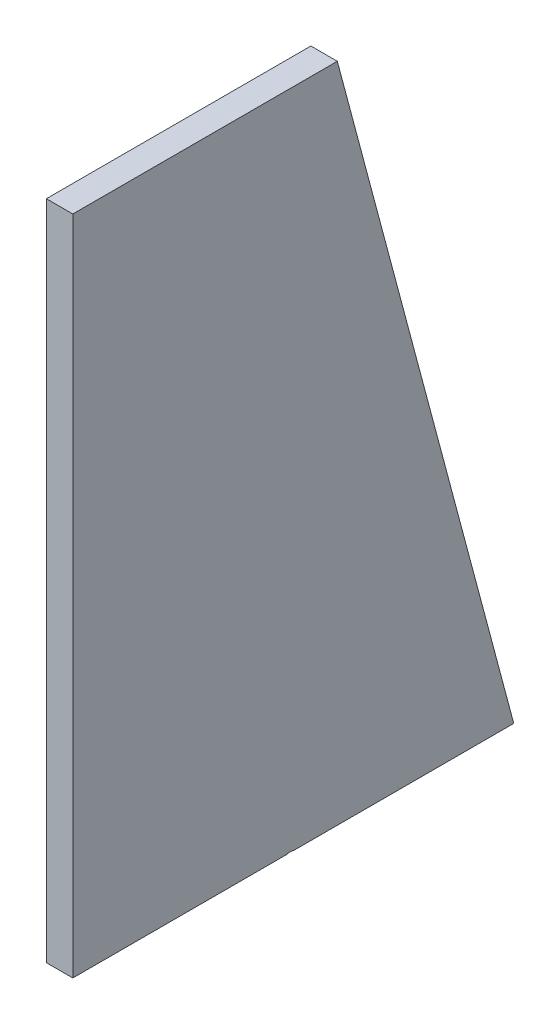
ISO-10303-21;
HEADER;
FILE_DESCRIPTION(('STEP AP214'),'2;1');
FILE_NAME('part.step','',(''),(''),'','','');
FILE_SCHEMA(('AUTOMOTIVE_DESIGN { 1 0 10303 214 1 1 1 1 }'));
ENDSEC;
DATA;
#1=APPLICATION_CONTEXT('core data for automotive mechanical design processes');
#2=APPLICATION_PROTOCOL_DEFINITION('international standard','automotive_design',2000,#1);
#3=PRODUCT_CONTEXT('',#1,'mechanical');
#4=PRODUCT('Part','Part','',(#3));
#5=PRODUCT_RELATED_PRODUCT_CATEGORY('part','',(#4));
#6=PRODUCT_DEFINITION_FORMATION('','',#4);
#7=PRODUCT_DEFINITION_CONTEXT('part definition',#1,'design');
#8=PRODUCT_DEFINITION('design','',#6,#7);
#9=PRODUCT_DEFINITION_SHAPE('','',#8);
#10=(LENGTH_UNIT() NAMED_UNIT(*) SI_UNIT(.MILLI.,.METRE.));
#11=(NAMED_UNIT(*) PLANE_ANGLE_UNIT() SI_UNIT($,.RADIAN.));
#12=(NAMED_UNIT(*) SI_UNIT($,.STERADIAN.) SOLID_ANGLE_UNIT());
#13=UNCERTAINTY_MEASURE_WITH_UNIT(LENGTH_MEASURE(1.E-05),#10,'distance_accuracy_value','');
#14=(GEOMETRIC_REPRESENTATION_CONTEXT(3) GLOBAL_UNCERTAINTY_ASSIGNED_CONTEXT((#13)) GLOBAL_UNIT_ASSIGNED_CONTEXT((#10,
#11,#12)) REPRESENTATION_CONTEXT('',''));
#15=CARTESIAN_POINT('',(0.,0.,0.));
#16=DIRECTION('',(0.,0.,1.));
#17=DIRECTION('',(1.,0.,0.));
#18=AXIS2_PLACEMENT_3D('',#15,#16,#17);
#19=CARTESIAN_POINT('',(6.,0.,0.));
#20=DIRECTION('',(0.,1.,0.));
#21=DIRECTION('',(0.,0.,1.));
#22=AXIS2_PLACEMENT_3D('',#19,#20,#21);
#23=PLANE('',#22);
#24=DIRECTION('',(0.,0.,-1.));
#25=VECTOR('',#24,1.);
#26=CARTESIAN_POINT('',(0.,0.,0.));
#27=LINE('',#26,#25);
#28=CARTESIAN_POINT('',(0.,0.,-48.5913022458668));
#29=VERTEX_POINT('',#28);
#30=CARTESIAN_POINT('',(0.,0.,-50.));
#31=VERTEX_POINT('',#30);
#32=EDGE_CURVE('E61',#29,#31,#27,.T.);
#33=ORIENTED_EDGE('',*,*,#32,.T.);
#34=CARTESIAN_POINT('',(3.,0.,-50.));
#35=DIRECTION('',(0.,-1.,0.));
#36=DIRECTION('',(0.,0.,-1.));
#37=AXIS2_PLACEMENT_3D('',#34,#35,#36);
#38=CIRCLE('',#37,3.);
#39=CARTESIAN_POINT('',(6.,0.,-50.));
#40=VERTEX_POINT('',#39);
#41=EDGE_CURVE('E56',#31,#40,#38,.T.);
#42=ORIENTED_EDGE('',*,*,#41,.T.);
#43=DIRECTION('',(0.,0.,-1.));
#44=VECTOR('',#43,1.);
#45=CARTESIAN_POINT('',(6.,0.,0.));
#46=LINE('',#45,#44);
#47=CARTESIAN_POINT('',(6.,0.,-48.5913022458668));
#48=VERTEX_POINT('',#47);
#49=EDGE_CURVE('E221',#48,#40,#46,.T.);
#50=ORIENTED_EDGE('',*,*,#49,.F.);
#51=DIRECTION('',(1.,0.,0.));
#52=VECTOR('',#51,1.);
#53=CARTESIAN_POINT('',(0.,0.,-48.5913022458668));
#54=LINE('',#53,#52);
#55=CARTESIAN_POINT('',(5.9213287919423,0.,-48.5913022458668));
#56=VERTEX_POINT('',#55);
#57=EDGE_CURVE('E193',#56,#48,#54,.T.);
#58=ORIENTED_EDGE('',*,*,#57,.F.);
#59=DIRECTION('',(0.0595238095238096,0.,-0.998226886083406));
#60=VECTOR('',#59,1.);
#61=CARTESIAN_POINT('',(3.01313805511083,0.,0.179672034646414));
#62=LINE('',#61,#60);
#63=CARTESIAN_POINT('',(4.74689705064596,0.,-28.8958333333333));
#64=VERTEX_POINT('',#63);
#65=EDGE_CURVE('E190',#64,#56,#62,.T.);
#66=ORIENTED_EDGE('',*,*,#65,.F.);
#67=CARTESIAN_POINT('',(3.,0.,-29.));
#68=DIRECTION('',(0.,-1.,0.));
#69=DIRECTION('',(0.,0.,-1.));
#70=AXIS2_PLACEMENT_3D('',#67,#68,#69);
#71=CIRCLE('',#70,1.75);
#72=CARTESIAN_POINT('',(1.25310294935404,0.,-28.8958333333333));
#73=VERTEX_POINT('',#72);
#74=EDGE_CURVE('E141',#64,#73,#71,.T.);
#75=ORIENTED_EDGE('',*,*,#74,.T.);
#76=DIRECTION('',(0.0595238095238098,0.,0.998226886083406));
#77=VECTOR('',#76,1.);
#78=CARTESIAN_POINT('',(2.96560344148782,0.,-0.176837567526233));
#79=LINE('',#78,#77);
#80=CARTESIAN_POINT('',(0.0786712080577037,0.,-48.5913022458668));
#81=VERTEX_POINT('',#80);
#82=EDGE_CURVE('E172',#81,#73,#79,.T.);
#83=ORIENTED_EDGE('',*,*,#82,.F.);
#84=DIRECTION('',(1.,0.,0.));
#85=VECTOR('',#84,1.);
#86=CARTESIAN_POINT('',(0.,0.,-48.5913022458668));
#87=LINE('',#86,#85);
#88=EDGE_CURVE('E196',#29,#81,#87,.T.);
#89=ORIENTED_EDGE('',*,*,#88,.F.);
#90=EDGE_LOOP('',(#33,#42,#50,#58,#66,#75,#83,#89));
#91=FACE_BOUND('',#90,.T.);
#92=ADVANCED_FACE('F41',(#91),#23,.F.);
#93=CARTESIAN_POINT('',(6.,0.,0.));
#94=DIRECTION('',(0.,0.,-1.));
#95=DIRECTION('',(-1.,0.,0.));
#96=AXIS2_PLACEMENT_3D('',#93,#94,#95);
#97=PLANE('',#96);
#98=DIRECTION('',(0.,-1.,0.));
#99=VECTOR('',#98,1.);
#100=CARTESIAN_POINT('',(0.,0.,0.));
#101=LINE('',#100,#99);
#102=CARTESIAN_POINT('',(0.,150.,0.));
#103=VERTEX_POINT('',#102);
#104=CARTESIAN_POINT('',(0.,-0.1,0.));
#105=VERTEX_POINT('',#104);
#106=EDGE_CURVE('E218',#103,#105,#101,.T.);
#107=ORIENTED_EDGE('',*,*,#106,.T.);
#108=DIRECTION('',(-1.,0.,0.));
#109=VECTOR('',#108,1.);
#110=CARTESIAN_POINT('',(0.,-0.1,0.));
#111=LINE('',#110,#109);
#112=CARTESIAN_POINT('',(6.,-0.1,0.));
#113=VERTEX_POINT('',#112);
#114=EDGE_CURVE('E179',#113,#105,#111,.T.);
#115=ORIENTED_EDGE('',*,*,#114,.F.);
#116=DIRECTION('',(0.,-1.,0.));
#117=VECTOR('',#116,1.);
#118=CARTESIAN_POINT('',(6.,0.,0.));
#119=LINE('',#118,#117);
#120=CARTESIAN_POINT('',(6.,150.,0.));
#121=VERTEX_POINT('',#120);
#122=EDGE_CURVE('E219',#121,#113,#119,.T.);
#123=ORIENTED_EDGE('',*,*,#122,.F.);
#124=DIRECTION('',(-1.,0.,0.));
#125=VECTOR('',#124,1.);
#126=CARTESIAN_POINT('',(6.,150.,0.));
#127=LINE('',#126,#125);
#128=EDGE_CURVE('E228',#121,#103,#127,.T.);
#129=ORIENTED_EDGE('',*,*,#128,.T.);
#130=EDGE_LOOP('',(#107,#115,#123,#129));
#131=FACE_BOUND('',#130,.T.);
#132=ADVANCED_FACE('F43',(#131),#97,.F.);
#133=CARTESIAN_POINT('',(6.,150.,-60.));
#134=DIRECTION('',(0.,-0.257662650560332,0.966234939601246));
#135=DIRECTION('',(0.,-0.966234939601246,-0.257662650560332));
#136=AXIS2_PLACEMENT_3D('',#133,#134,#135);
#137=PLANE('',#136);
#138=DIRECTION('',(0.,0.966234939601246,0.257662650560332));
#139=VECTOR('',#138,1.);
#140=CARTESIAN_POINT('',(0.,150.,-60.));
#141=LINE('',#140,#139);
#142=CARTESIAN_POINT('',(0.,0.,-100.));
#143=VERTEX_POINT('',#142);
#144=CARTESIAN_POINT('',(0.,150.,-60.));
#145=VERTEX_POINT('',#144);
#146=EDGE_CURVE('E231',#143,#145,#141,.T.);
#147=ORIENTED_EDGE('',*,*,#146,.T.);
#148=DIRECTION('',(-1.,0.,0.));
#149=VECTOR('',#148,1.);
#150=CARTESIAN_POINT('',(6.,150.,-60.));
#151=LINE('',#150,#149);
#152=CARTESIAN_POINT('',(6.,150.,-60.));
#153=VERTEX_POINT('',#152);
#154=EDGE_CURVE('E49',#153,#145,#151,.T.);
#155=ORIENTED_EDGE('',*,*,#154,.F.);
#156=DIRECTION('',(0.,0.966234939601246,0.257662650560332));
#157=VECTOR('',#156,1.);
#158=CARTESIAN_POINT('',(6.,150.,-60.));
#159=LINE('',#158,#157);
#160=CARTESIAN_POINT('',(6.,0.,-100.));
#161=VERTEX_POINT('',#160);
#162=EDGE_CURVE('E224',#161,#153,#159,.T.);
#163=ORIENTED_EDGE('',*,*,#162,.F.);
#164=DIRECTION('',(-1.,0.,0.));
#165=VECTOR('',#164,1.);
#166=CARTESIAN_POINT('',(6.,0.,-100.));
#167=LINE('',#166,#165);
#168=EDGE_CURVE('E11',#161,#143,#167,.T.);
#169=ORIENTED_EDGE('',*,*,#168,.T.);
#170=EDGE_LOOP('',(#147,#155,#163,#169));
#171=FACE_BOUND('',#170,.T.);
#172=ADVANCED_FACE('F258',(#171),#137,.F.);
#173=CARTESIAN_POINT('',(6.,150.,0.));
#174=DIRECTION('',(0.,-1.,0.));
#175=DIRECTION('',(0.,0.,-1.));
#176=AXIS2_PLACEMENT_3D('',#173,#174,#175);
#177=PLANE('',#176);
#178=DIRECTION('',(0.,0.,1.));
#179=VECTOR('',#178,1.);
#180=CARTESIAN_POINT('',(0.,150.,0.));
#181=LINE('',#180,#179);
#182=EDGE_CURVE('E222',#145,#103,#181,.T.);
#183=ORIENTED_EDGE('',*,*,#182,.T.);
#184=ORIENTED_EDGE('',*,*,#128,.F.);
#185=DIRECTION('',(0.,0.,1.));
#186=VECTOR('',#185,1.);
#187=CARTESIAN_POINT('',(6.,150.,0.));
#188=LINE('',#187,#186);
#189=EDGE_CURVE('E226',#153,#121,#188,.T.);
#190=ORIENTED_EDGE('',*,*,#189,.F.);
#191=ORIENTED_EDGE('',*,*,#154,.T.);
#192=EDGE_LOOP('',(#183,#184,#190,#191));
#193=FACE_BOUND('',#192,.T.);
#194=ADVANCED_FACE('F240',(#193),#177,.F.);
#195=CARTESIAN_POINT('',(6.,0.,0.));
#196=DIRECTION('',(-1.,0.,0.));
#197=DIRECTION('',(0.,0.,1.));
#198=AXIS2_PLACEMENT_3D('',#195,#196,#197);
#199=PLANE('',#198);
#200=ORIENTED_EDGE('',*,*,#122,.T.);
#201=DIRECTION('',(0.,0.,1.));
#202=VECTOR('',#201,1.);
#203=CARTESIAN_POINT('',(6.,-0.1,0.));
#204=LINE('',#203,#202);
#205=CARTESIAN_POINT('',(6.,-0.1,-48.5913022458668));
#206=VERTEX_POINT('',#205);
#207=EDGE_CURVE('E176',#206,#113,#204,.T.);
#208=ORIENTED_EDGE('',*,*,#207,.F.);
#209=DIRECTION('',(0.,1.,0.));
#210=VECTOR('',#209,1.);
#211=CARTESIAN_POINT('',(6.,-0.1,-48.5913022458668));
#212=LINE('',#211,#210);
#213=EDGE_CURVE('E209',#206,#48,#212,.T.);
#214=ORIENTED_EDGE('',*,*,#213,.T.);
#215=ORIENTED_EDGE('',*,*,#49,.T.);
#216=DIRECTION('',(0.,1.,0.));
#217=VECTOR('',#216,1.);
#218=CARTESIAN_POINT('',(6.,-0.1,-50.));
#219=LINE('',#218,#217);
#220=CARTESIAN_POINT('',(6.,-0.1,-50.));
#221=VERTEX_POINT('',#220);
#222=EDGE_CURVE('E161',#221,#40,#219,.T.);
#223=ORIENTED_EDGE('',*,*,#222,.F.);
#224=DIRECTION('',(0.,0.,1.));
#225=VECTOR('',#224,1.);
#226=CARTESIAN_POINT('',(6.,-0.1,0.));
#227=LINE('',#226,#225);
#228=CARTESIAN_POINT('',(6.,-0.1,-100.));
#229=VERTEX_POINT('',#228);
#230=EDGE_CURVE('E155',#229,#221,#227,.T.);
#231=ORIENTED_EDGE('',*,*,#230,.F.);
#232=DIRECTION('',(0.,1.,0.));
#233=VECTOR('',#232,1.);
#234=CARTESIAN_POINT('',(6.,-0.1,-100.));
#235=LINE('',#234,#233);
#236=EDGE_CURVE('E164',#229,#161,#235,.T.);
#237=ORIENTED_EDGE('',*,*,#236,.T.);
#238=ORIENTED_EDGE('',*,*,#162,.T.);
#239=ORIENTED_EDGE('',*,*,#189,.T.);
#240=EDGE_LOOP('',(#200,#208,#214,#215,#223,#231,#237,#238,#239));
#241=FACE_BOUND('',#240,.T.);
#242=ADVANCED_FACE('F255',(#241),#199,.F.);
#243=CARTESIAN_POINT('',(0.,0.,0.));
#244=DIRECTION('',(-1.,0.,0.));
#245=DIRECTION('',(0.,0.,1.));
#246=AXIS2_PLACEMENT_3D('',#243,#244,#245);
#247=PLANE('',#246);
#248=ORIENTED_EDGE('',*,*,#106,.F.);
#249=ORIENTED_EDGE('',*,*,#182,.F.);
#250=ORIENTED_EDGE('',*,*,#146,.F.);
#251=DIRECTION('',(0.,1.,0.));
#252=VECTOR('',#251,1.);
#253=CARTESIAN_POINT('',(0.,-0.1,-100.));
#254=LINE('',#253,#252);
#255=CARTESIAN_POINT('',(0.,-0.1,-100.));
#256=VERTEX_POINT('',#255);
#257=EDGE_CURVE('E142',#256,#143,#254,.T.);
#258=ORIENTED_EDGE('',*,*,#257,.F.);
#259=DIRECTION('',(0.,0.,-1.));
#260=VECTOR('',#259,1.);
#261=CARTESIAN_POINT('',(0.,-0.1,0.));
#262=LINE('',#261,#260);
#263=CARTESIAN_POINT('',(0.,-0.1,-50.));
#264=VERTEX_POINT('',#263);
#265=EDGE_CURVE('E145',#264,#256,#262,.T.);
#266=ORIENTED_EDGE('',*,*,#265,.F.);
#267=DIRECTION('',(0.,1.,0.));
#268=VECTOR('',#267,1.);
#269=CARTESIAN_POINT('',(0.,-0.1,-50.));
#270=LINE('',#269,#268);
#271=EDGE_CURVE('E134',#264,#31,#270,.T.);
#272=ORIENTED_EDGE('',*,*,#271,.T.);
#273=ORIENTED_EDGE('',*,*,#32,.F.);
#274=DIRECTION('',(0.,1.,0.));
#275=VECTOR('',#274,1.);
#276=CARTESIAN_POINT('',(0.,-0.1,-48.5913022458668));
#277=LINE('',#276,#275);
#278=CARTESIAN_POINT('',(0.,-0.1,-48.5913022458668));
#279=VERTEX_POINT('',#278);
#280=EDGE_CURVE('E206',#279,#29,#277,.T.);
#281=ORIENTED_EDGE('',*,*,#280,.F.);
#282=DIRECTION('',(0.,0.,-1.));
#283=VECTOR('',#282,1.);
#284=CARTESIAN_POINT('',(0.,-0.1,0.));
#285=LINE('',#284,#283);
#286=EDGE_CURVE('E182',#105,#279,#285,.T.);
#287=ORIENTED_EDGE('',*,*,#286,.F.);
#288=EDGE_LOOP('',(#248,#249,#250,#258,#266,#272,#273,#281,#287));
#289=FACE_BOUND('',#288,.T.);
#290=ADVANCED_FACE('F147',(#289),#247,.T.);
#291=CARTESIAN_POINT('',(3.,-0.1,-29.));
#292=DIRECTION('',(0.,1.,0.));
#293=DIRECTION('',(0.,0.,1.));
#294=AXIS2_PLACEMENT_3D('',#291,#292,#293);
#295=CYLINDRICAL_SURFACE('',#294,1.75);
#296=ORIENTED_EDGE('',*,*,#74,.F.);
#297=DIRECTION('',(0.,1.,0.));
#298=VECTOR('',#297,1.);
#299=CARTESIAN_POINT('',(4.74689705064596,-0.1,-28.8958333333333));
#300=LINE('',#299,#298);
#301=CARTESIAN_POINT('',(4.74689705064596,-0.1,-28.8958333333333));
#302=VERTEX_POINT('',#301);
#303=EDGE_CURVE('E215',#302,#64,#300,.T.);
#304=ORIENTED_EDGE('',*,*,#303,.F.);
#305=CARTESIAN_POINT('',(3.,-0.1,-29.));
#306=DIRECTION('',(0.,-1.,0.));
#307=DIRECTION('',(0.,0.,-1.));
#308=AXIS2_PLACEMENT_3D('',#305,#306,#307);
#309=CIRCLE('',#308,1.75);
#310=CARTESIAN_POINT('',(1.25310294935404,-0.1,-28.8958333333333));
#311=VERTEX_POINT('',#310);
#312=EDGE_CURVE('E168',#302,#311,#309,.T.);
#313=ORIENTED_EDGE('',*,*,#312,.T.);
#314=DIRECTION('',(0.,1.,0.));
#315=VECTOR('',#314,1.);
#316=CARTESIAN_POINT('',(1.25310294935404,-0.1,-28.8958333333333));
#317=LINE('',#316,#315);
#318=EDGE_CURVE('E188',#311,#73,#317,.T.);
#319=ORIENTED_EDGE('',*,*,#318,.T.);
#320=EDGE_LOOP('',(#296,#304,#313,#319));
#321=FACE_BOUND('',#320,.T.);
#322=ADVANCED_FACE('F270',(#321),#295,.F.);
#323=CARTESIAN_POINT('',(3.01313805511083,-0.1,0.179672034646414));
#324=DIRECTION('',(0.998226886083406,0.,0.0595238095238096));
#325=DIRECTION('',(0.0595238095238096,0.,-0.998226886083406));
#326=AXIS2_PLACEMENT_3D('',#323,#324,#325);
#327=PLANE('',#326);
#328=ORIENTED_EDGE('',*,*,#65,.T.);
#329=DIRECTION('',(0.,1.,0.));
#330=VECTOR('',#329,1.);
#331=CARTESIAN_POINT('',(5.9213287919423,-0.1,-48.5913022458668));
#332=LINE('',#331,#330);
#333=CARTESIAN_POINT('',(5.9213287919423,-0.1,-48.5913022458668));
#334=VERTEX_POINT('',#333);
#335=EDGE_CURVE('E212',#334,#56,#332,.T.);
#336=ORIENTED_EDGE('',*,*,#335,.F.);
#337=DIRECTION('',(0.0595238095238096,0.,-0.998226886083406));
#338=VECTOR('',#337,1.);
#339=CARTESIAN_POINT('',(3.01313805511083,-0.1,0.179672034646414));
#340=LINE('',#339,#338);
#341=EDGE_CURVE('E171',#302,#334,#340,.T.);
#342=ORIENTED_EDGE('',*,*,#341,.F.);
#343=ORIENTED_EDGE('',*,*,#303,.T.);
#344=EDGE_LOOP('',(#328,#336,#342,#343));
#345=FACE_BOUND('',#344,.T.);
#346=ADVANCED_FACE('F266',(#345),#327,.F.);
#347=CARTESIAN_POINT('',(0.,-0.1,-48.5913022458668));
#348=DIRECTION('',(0.,0.,1.));
#349=DIRECTION('',(1.,0.,0.));
#350=AXIS2_PLACEMENT_3D('',#347,#348,#349);
#351=PLANE('',#350);
#352=ORIENTED_EDGE('',*,*,#57,.T.);
#353=ORIENTED_EDGE('',*,*,#213,.F.);
#354=DIRECTION('',(1.,0.,0.));
#355=VECTOR('',#354,1.);
#356=CARTESIAN_POINT('',(0.,-0.1,-48.5913022458668));
#357=LINE('',#356,#355);
#358=EDGE_CURVE('E174',#334,#206,#357,.T.);
#359=ORIENTED_EDGE('',*,*,#358,.F.);
#360=ORIENTED_EDGE('',*,*,#335,.T.);
#361=EDGE_LOOP('',(#352,#353,#359,#360));
#362=FACE_BOUND('',#361,.T.);
#363=ADVANCED_FACE('F262',(#362),#351,.F.);
#364=CARTESIAN_POINT('',(0.,-0.1,-48.5913022458668));
#365=DIRECTION('',(0.,0.,1.));
#366=DIRECTION('',(1.,0.,0.));
#367=AXIS2_PLACEMENT_3D('',#364,#365,#366);
#368=PLANE('',#367);
#369=ORIENTED_EDGE('',*,*,#88,.T.);
#370=DIRECTION('',(0.,1.,0.));
#371=VECTOR('',#370,1.);
#372=CARTESIAN_POINT('',(0.0786712080577037,-0.1,-48.5913022458668));
#373=LINE('',#372,#371);
#374=CARTESIAN_POINT('',(0.0786712080577037,-0.1,-48.5913022458668));
#375=VERTEX_POINT('',#374);
#376=EDGE_CURVE('E203',#375,#81,#373,.T.);
#377=ORIENTED_EDGE('',*,*,#376,.F.);
#378=DIRECTION('',(1.,0.,0.));
#379=VECTOR('',#378,1.);
#380=CARTESIAN_POINT('',(0.,-0.1,-48.5913022458668));
#381=LINE('',#380,#379);
#382=EDGE_CURVE('E184',#279,#375,#381,.T.);
#383=ORIENTED_EDGE('',*,*,#382,.F.);
#384=ORIENTED_EDGE('',*,*,#280,.T.);
#385=EDGE_LOOP('',(#369,#377,#383,#384));
#386=FACE_BOUND('',#385,.T.);
#387=ADVANCED_FACE('F277',(#386),#368,.F.);
#388=CARTESIAN_POINT('',(2.96560344148782,-0.1,-0.176837567526233));
#389=DIRECTION('',(-0.998226886083406,0.,0.0595238095238097));
#390=DIRECTION('',(0.0595238095238097,0.,0.998226886083406));
#391=AXIS2_PLACEMENT_3D('',#388,#389,#390);
#392=PLANE('',#391);
#393=ORIENTED_EDGE('',*,*,#82,.T.);
#394=ORIENTED_EDGE('',*,*,#318,.F.);
#395=DIRECTION('',(0.0595238095238098,0.,0.998226886083406));
#396=VECTOR('',#395,1.);
#397=CARTESIAN_POINT('',(2.96560344148782,-0.1,-0.176837567526233));
#398=LINE('',#397,#396);
#399=EDGE_CURVE('E186',#375,#311,#398,.T.);
#400=ORIENTED_EDGE('',*,*,#399,.F.);
#401=ORIENTED_EDGE('',*,*,#376,.T.);
#402=EDGE_LOOP('',(#393,#394,#400,#401));
#403=FACE_BOUND('',#402,.T.);
#404=ADVANCED_FACE('F273',(#403),#392,.F.);
#405=CARTESIAN_POINT('',(0.,-0.1,0.));
#406=DIRECTION('',(0.,-1.,0.));
#407=DIRECTION('',(0.,0.,-1.));
#408=AXIS2_PLACEMENT_3D('',#405,#406,#407);
#409=PLANE('',#408);
#410=ORIENTED_EDGE('',*,*,#312,.F.);
#411=ORIENTED_EDGE('',*,*,#341,.T.);
#412=ORIENTED_EDGE('',*,*,#358,.T.);
#413=ORIENTED_EDGE('',*,*,#207,.T.);
#414=ORIENTED_EDGE('',*,*,#114,.T.);
#415=ORIENTED_EDGE('',*,*,#286,.T.);
#416=ORIENTED_EDGE('',*,*,#382,.T.);
#417=ORIENTED_EDGE('',*,*,#399,.T.);
#418=EDGE_LOOP('',(#410,#411,#412,#413,#414,#415,#416,#417));
#419=FACE_BOUND('',#418,.T.);
#420=ADVANCED_FACE('F250',(#419),#409,.T.);
#421=CARTESIAN_POINT('',(3.,-0.1,-50.));
#422=DIRECTION('',(0.,1.,0.));
#423=DIRECTION('',(0.,0.,1.));
#424=AXIS2_PLACEMENT_3D('',#421,#422,#423);
#425=CYLINDRICAL_SURFACE('',#424,3.);
#426=ORIENTED_EDGE('',*,*,#41,.F.);
#427=ORIENTED_EDGE('',*,*,#271,.F.);
#428=CARTESIAN_POINT('',(3.,-0.1,-50.));
#429=DIRECTION('',(0.,-1.,0.));
#430=DIRECTION('',(0.,0.,-1.));
#431=AXIS2_PLACEMENT_3D('',#428,#429,#430);
#432=CIRCLE('',#431,3.);
#433=EDGE_CURVE('E139',#264,#221,#432,.T.);
#434=ORIENTED_EDGE('',*,*,#433,.T.);
#435=ORIENTED_EDGE('',*,*,#222,.T.);
#436=EDGE_LOOP('',(#426,#427,#434,#435));
#437=FACE_BOUND('',#436,.T.);
#438=ADVANCED_FACE('F136',(#437),#425,.F.);
#439=CARTESIAN_POINT('',(0.,-0.1,-100.));
#440=DIRECTION('',(0.,0.,1.));
#441=DIRECTION('',(1.,0.,0.));
#442=AXIS2_PLACEMENT_3D('',#439,#440,#441);
#443=PLANE('',#442);
#444=ORIENTED_EDGE('',*,*,#168,.F.);
#445=ORIENTED_EDGE('',*,*,#236,.F.);
#446=DIRECTION('',(1.,0.,0.));
#447=VECTOR('',#446,1.);
#448=CARTESIAN_POINT('',(0.,-0.1,-100.));
#449=LINE('',#448,#447);
#450=EDGE_CURVE('E151',#256,#229,#449,.T.);
#451=ORIENTED_EDGE('',*,*,#450,.F.);
#452=ORIENTED_EDGE('',*,*,#257,.T.);
#453=EDGE_LOOP('',(#444,#445,#451,#452));
#454=FACE_BOUND('',#453,.T.);
#455=ADVANCED_FACE('F260',(#454),#443,.F.);
#456=CARTESIAN_POINT('',(0.,-0.1,0.));
#457=DIRECTION('',(0.,-1.,0.));
#458=DIRECTION('',(0.,0.,-1.));
#459=AXIS2_PLACEMENT_3D('',#456,#457,#458);
#460=PLANE('',#459);
#461=ORIENTED_EDGE('',*,*,#433,.F.);
#462=ORIENTED_EDGE('',*,*,#265,.T.);
#463=ORIENTED_EDGE('',*,*,#450,.T.);
#464=ORIENTED_EDGE('',*,*,#230,.T.);
#465=EDGE_LOOP('',(#461,#462,#463,#464));
#466=FACE_BOUND('',#465,.T.);
#467=ADVANCED_FACE('F153',(#466),#460,.T.);
#468=CLOSED_SHELL('',(#92,#132,#172,#194,#242,#290,#322,#346,#363,#387,#404,#420,#438,#455,#467));
#469=MANIFOLD_SOLID_BREP('B2',#468);
#470=ADVANCED_BREP_SHAPE_REPRESENTATION('',(#18,#469),#14);
#471=SHAPE_DEFINITION_REPRESENTATION(#9,#470);
ENDSEC;
END-ISO-10303-21;
